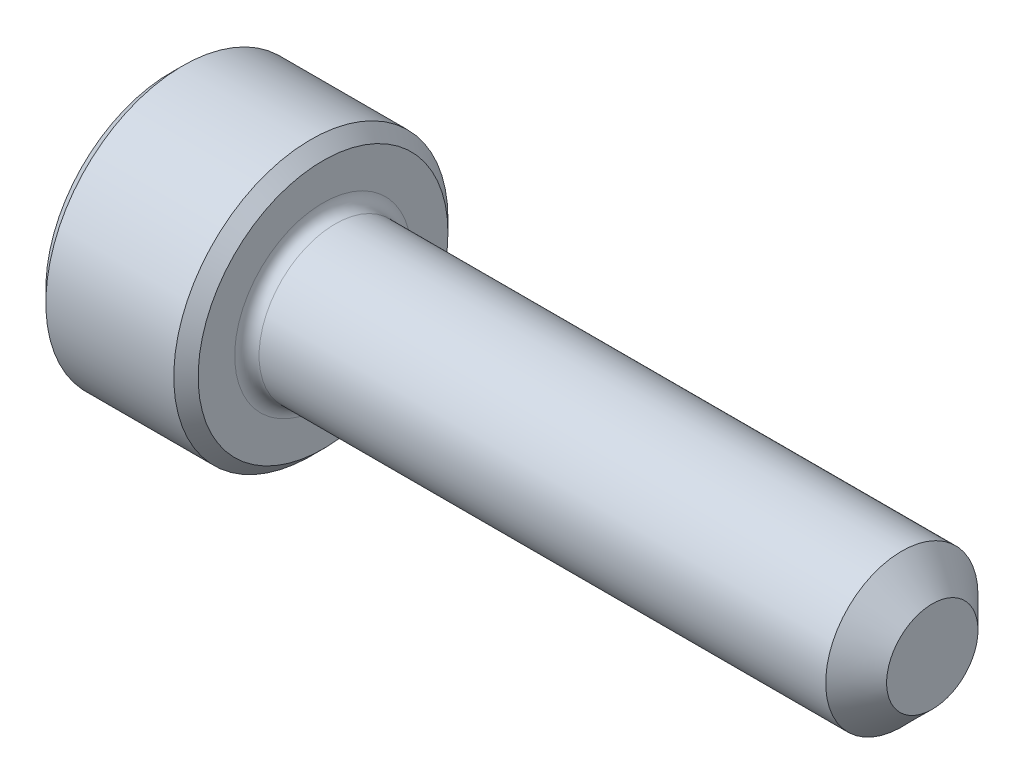
ISO-10303-21;
HEADER;
FILE_DESCRIPTION(('STEP AP214'),'2;1');
FILE_NAME('part.step','',(''),(''),'','','');
FILE_SCHEMA(('AUTOMOTIVE_DESIGN { 1 0 10303 214 1 1 1 1 }'));
ENDSEC;
DATA;
#1=APPLICATION_CONTEXT('core data for automotive mechanical design processes');
#2=APPLICATION_PROTOCOL_DEFINITION('international standard','automotive_design',2000,#1);
#3=PRODUCT_CONTEXT('',#1,'mechanical');
#4=PRODUCT('Part','Part','',(#3));
#5=PRODUCT_RELATED_PRODUCT_CATEGORY('part','',(#4));
#6=PRODUCT_DEFINITION_FORMATION('','',#4);
#7=PRODUCT_DEFINITION_CONTEXT('part definition',#1,'design');
#8=PRODUCT_DEFINITION('design','',#6,#7);
#9=PRODUCT_DEFINITION_SHAPE('','',#8);
#10=(LENGTH_UNIT() NAMED_UNIT(*) SI_UNIT(.MILLI.,.METRE.));
#11=(NAMED_UNIT(*) PLANE_ANGLE_UNIT() SI_UNIT($,.RADIAN.));
#12=(NAMED_UNIT(*) SI_UNIT($,.STERADIAN.) SOLID_ANGLE_UNIT());
#13=UNCERTAINTY_MEASURE_WITH_UNIT(LENGTH_MEASURE(1.E-05),#10,'distance_accuracy_value','');
#14=(GEOMETRIC_REPRESENTATION_CONTEXT(3) GLOBAL_UNCERTAINTY_ASSIGNED_CONTEXT((#13)) GLOBAL_UNIT_ASSIGNED_CONTEXT((#10,
#11,#12)) REPRESENTATION_CONTEXT('',''));
#15=CARTESIAN_POINT('',(0.,0.,0.));
#16=DIRECTION('',(0.,0.,1.));
#17=DIRECTION('',(1.,0.,0.));
#18=AXIS2_PLACEMENT_3D('',#15,#16,#17);
#19=CARTESIAN_POINT('',(12.5,0.75,0.));
#20=DIRECTION('',(1.,0.,0.));
#21=DIRECTION('',(0.,0.,-1.));
#22=AXIS2_PLACEMENT_3D('',#19,#20,#21);
#23=PLANE('',#22);
#24=CARTESIAN_POINT('',(12.5,0.,0.));
#25=DIRECTION('',(1.,0.,0.));
#26=DIRECTION('',(0.,0.,-1.));
#27=AXIS2_PLACEMENT_3D('',#24,#25,#26);
#28=CIRCLE('',#27,0.75);
#29=CARTESIAN_POINT('',(12.5,0.,-0.75));
#30=VERTEX_POINT('',#29);
#31=EDGE_CURVE('E11',#30,#30,#28,.T.);
#32=ORIENTED_EDGE('',*,*,#31,.T.);
#33=EDGE_LOOP('',(#32));
#34=FACE_BOUND('',#33,.T.);
#35=ADVANCED_FACE('F40',(#34),#23,.T.);
#36=CARTESIAN_POINT('',(12.5,0.,0.));
#37=DIRECTION('',(-1.,0.,0.));
#38=DIRECTION('',(0.,0.,1.));
#39=AXIS2_PLACEMENT_3D('',#36,#37,#38);
#40=CONICAL_SURFACE('',#39,0.75,0.785398163397448);
#41=CARTESIAN_POINT('',(12.,0.,0.));
#42=DIRECTION('',(1.,0.,0.));
#43=DIRECTION('',(0.,0.,-1.));
#44=AXIS2_PLACEMENT_3D('',#41,#42,#43);
#45=CIRCLE('',#44,1.25);
#46=CARTESIAN_POINT('',(12.,0.,-1.25));
#47=VERTEX_POINT('',#46);
#48=EDGE_CURVE('E48',#47,#47,#45,.T.);
#49=ORIENTED_EDGE('',*,*,#48,.T.);
#50=EDGE_LOOP('',(#49));
#51=FACE_BOUND('',#50,.T.);
#52=ORIENTED_EDGE('',*,*,#31,.F.);
#53=EDGE_LOOP('',(#52));
#54=FACE_BOUND('',#53,.T.);
#55=ADVANCED_FACE('F190',(#51,#54),#40,.T.);
#56=CARTESIAN_POINT('',(0.,0.,0.));
#57=DIRECTION('',(1.,0.,0.));
#58=DIRECTION('',(0.,0.,-1.));
#59=AXIS2_PLACEMENT_3D('',#56,#57,#58);
#60=CYLINDRICAL_SURFACE('',#59,1.25);
#61=CARTESIAN_POINT('',(2.7,0.,0.));
#62=DIRECTION('',(1.,0.,0.));
#63=DIRECTION('',(0.,0.,-1.));
#64=AXIS2_PLACEMENT_3D('',#61,#62,#63);
#65=CIRCLE('',#64,1.25);
#66=CARTESIAN_POINT('',(2.7,0.,-1.25));
#67=VERTEX_POINT('',#66);
#68=EDGE_CURVE('E183',#67,#67,#65,.T.);
#69=ORIENTED_EDGE('',*,*,#68,.T.);
#70=EDGE_LOOP('',(#69));
#71=FACE_BOUND('',#70,.T.);
#72=ORIENTED_EDGE('',*,*,#48,.F.);
#73=EDGE_LOOP('',(#72));
#74=FACE_BOUND('',#73,.T.);
#75=ADVANCED_FACE('F193',(#71,#74),#60,.T.);
#76=CARTESIAN_POINT('',(2.7,0.,0.));
#77=DIRECTION('',(1.,0.,0.));
#78=DIRECTION('',(0.,0.,-1.));
#79=AXIS2_PLACEMENT_3D('',#76,#77,#78);
#80=TOROIDAL_SURFACE('',#79,1.45,0.2);
#81=CARTESIAN_POINT('',(2.5,0.,0.));
#82=DIRECTION('',(1.,0.,0.));
#83=DIRECTION('',(0.,0.,-1.));
#84=AXIS2_PLACEMENT_3D('',#81,#82,#83);
#85=CIRCLE('',#84,1.45);
#86=CARTESIAN_POINT('',(2.5,0.,-1.45));
#87=VERTEX_POINT('',#86);
#88=EDGE_CURVE('E179',#87,#87,#85,.T.);
#89=ORIENTED_EDGE('',*,*,#88,.T.);
#90=EDGE_LOOP('',(#89));
#91=FACE_BOUND('',#90,.T.);
#92=ORIENTED_EDGE('',*,*,#68,.F.);
#93=EDGE_LOOP('',(#92));
#94=FACE_BOUND('',#93,.T.);
#95=ADVANCED_FACE('F195',(#91,#94),#80,.F.);
#96=CARTESIAN_POINT('',(2.5,2.05,0.));
#97=DIRECTION('',(1.,0.,0.));
#98=DIRECTION('',(0.,0.,-1.));
#99=AXIS2_PLACEMENT_3D('',#96,#97,#98);
#100=PLANE('',#99);
#101=CARTESIAN_POINT('',(2.5,0.,0.));
#102=DIRECTION('',(1.,0.,0.));
#103=DIRECTION('',(0.,0.,-1.));
#104=AXIS2_PLACEMENT_3D('',#101,#102,#103);
#105=CIRCLE('',#104,2.05);
#106=CARTESIAN_POINT('',(2.5,0.,-2.05));
#107=VERTEX_POINT('',#106);
#108=EDGE_CURVE('E175',#107,#107,#105,.T.);
#109=ORIENTED_EDGE('',*,*,#108,.T.);
#110=EDGE_LOOP('',(#109));
#111=FACE_BOUND('',#110,.T.);
#112=ORIENTED_EDGE('',*,*,#88,.F.);
#113=EDGE_LOOP('',(#112));
#114=FACE_BOUND('',#113,.T.);
#115=ADVANCED_FACE('F201',(#111,#114),#100,.T.);
#116=CARTESIAN_POINT('',(2.5,0.,0.));
#117=DIRECTION('',(-1.,0.,0.));
#118=DIRECTION('',(0.,0.,1.));
#119=AXIS2_PLACEMENT_3D('',#116,#117,#118);
#120=CONICAL_SURFACE('',#119,2.05,0.785398163397448);
#121=CARTESIAN_POINT('',(2.3,0.,0.));
#122=DIRECTION('',(1.,0.,0.));
#123=DIRECTION('',(0.,0.,-1.));
#124=AXIS2_PLACEMENT_3D('',#121,#122,#123);
#125=CIRCLE('',#124,2.25);
#126=CARTESIAN_POINT('',(2.3,0.,-2.25));
#127=VERTEX_POINT('',#126);
#128=EDGE_CURVE('E172',#127,#127,#125,.T.);
#129=ORIENTED_EDGE('',*,*,#128,.T.);
#130=EDGE_LOOP('',(#129));
#131=FACE_BOUND('',#130,.T.);
#132=ORIENTED_EDGE('',*,*,#108,.F.);
#133=EDGE_LOOP('',(#132));
#134=FACE_BOUND('',#133,.T.);
#135=ADVANCED_FACE('F229',(#131,#134),#120,.T.);
#136=CARTESIAN_POINT('',(0.,0.,0.));
#137=DIRECTION('',(1.,0.,0.));
#138=DIRECTION('',(0.,0.,-1.));
#139=AXIS2_PLACEMENT_3D('',#136,#137,#138);
#140=CYLINDRICAL_SURFACE('',#139,2.25);
#141=CARTESIAN_POINT('',(0.2,0.,0.));
#142=DIRECTION('',(1.,0.,0.));
#143=DIRECTION('',(0.,0.,-1.));
#144=AXIS2_PLACEMENT_3D('',#141,#142,#143);
#145=CIRCLE('',#144,2.25);
#146=CARTESIAN_POINT('',(0.2,0.,-2.25));
#147=VERTEX_POINT('',#146);
#148=EDGE_CURVE('E168',#147,#147,#145,.T.);
#149=ORIENTED_EDGE('',*,*,#148,.T.);
#150=EDGE_LOOP('',(#149));
#151=FACE_BOUND('',#150,.T.);
#152=ORIENTED_EDGE('',*,*,#128,.F.);
#153=EDGE_LOOP('',(#152));
#154=FACE_BOUND('',#153,.T.);
#155=ADVANCED_FACE('F238',(#151,#154),#140,.T.);
#156=CARTESIAN_POINT('',(0.2,0.,0.));
#157=DIRECTION('',(1.,0.,0.));
#158=DIRECTION('',(0.,0.,-1.));
#159=AXIS2_PLACEMENT_3D('',#156,#157,#158);
#160=CONICAL_SURFACE('',#159,2.25,0.785398163397449);
#161=CARTESIAN_POINT('',(0.,0.,0.));
#162=DIRECTION('',(1.,0.,0.));
#163=DIRECTION('',(0.,0.,-1.));
#164=AXIS2_PLACEMENT_3D('',#161,#162,#163);
#165=CIRCLE('',#164,2.05);
#166=CARTESIAN_POINT('',(0.,0.,-2.05));
#167=VERTEX_POINT('',#166);
#168=EDGE_CURVE('E155',#167,#167,#165,.T.);
#169=ORIENTED_EDGE('',*,*,#168,.T.);
#170=EDGE_LOOP('',(#169));
#171=FACE_BOUND('',#170,.T.);
#172=ORIENTED_EDGE('',*,*,#148,.F.);
#173=EDGE_LOOP('',(#172));
#174=FACE_BOUND('',#173,.T.);
#175=ADVANCED_FACE('F247',(#171,#174),#160,.T.);
#176=CARTESIAN_POINT('',(0.,0.,0.));
#177=DIRECTION('',(-1.,0.,0.));
#178=DIRECTION('',(0.,0.,1.));
#179=AXIS2_PLACEMENT_3D('',#176,#177,#178);
#180=PLANE('',#179);
#181=DIRECTION('',(0.,0.5,-0.866025403784438));
#182=VECTOR('',#181,1.);
#183=CARTESIAN_POINT('',(0.,0.577350269189626,1.));
#184=LINE('',#183,#182);
#185=CARTESIAN_POINT('',(0.,0.577350269189626,1.));
#186=VERTEX_POINT('',#185);
#187=CARTESIAN_POINT('',(0.,1.15470053837925,0.));
#188=VERTEX_POINT('',#187);
#189=EDGE_CURVE('E55',#186,#188,#184,.T.);
#190=ORIENTED_EDGE('',*,*,#189,.F.);
#191=DIRECTION('',(0.,1.,0.));
#192=VECTOR('',#191,1.);
#193=CARTESIAN_POINT('',(0.,-0.577350269189627,1.));
#194=LINE('',#193,#192);
#195=CARTESIAN_POINT('',(0.,-0.577350269189627,1.));
#196=VERTEX_POINT('',#195);
#197=EDGE_CURVE('E149',#196,#186,#194,.T.);
#198=ORIENTED_EDGE('',*,*,#197,.F.);
#199=DIRECTION('',(0.,0.5,0.866025403784439));
#200=VECTOR('',#199,1.);
#201=CARTESIAN_POINT('',(0.,-1.15470053837925,0.));
#202=LINE('',#201,#200);
#203=CARTESIAN_POINT('',(0.,-1.15470053837925,0.));
#204=VERTEX_POINT('',#203);
#205=EDGE_CURVE('E146',#204,#196,#202,.T.);
#206=ORIENTED_EDGE('',*,*,#205,.F.);
#207=DIRECTION('',(0.,-0.5,0.866025403784439));
#208=VECTOR('',#207,1.);
#209=CARTESIAN_POINT('',(0.,-0.577350269189626,-1.));
#210=LINE('',#209,#208);
#211=CARTESIAN_POINT('',(0.,-0.577350269189626,-1.));
#212=VERTEX_POINT('',#211);
#213=EDGE_CURVE('E103',#212,#204,#210,.T.);
#214=ORIENTED_EDGE('',*,*,#213,.F.);
#215=DIRECTION('',(0.,-1.,0.));
#216=VECTOR('',#215,1.);
#217=CARTESIAN_POINT('',(0.,0.577350269189626,-1.));
#218=LINE('',#217,#216);
#219=CARTESIAN_POINT('',(0.,0.577350269189626,-1.));
#220=VERTEX_POINT('',#219);
#221=EDGE_CURVE('E140',#220,#212,#218,.T.);
#222=ORIENTED_EDGE('',*,*,#221,.F.);
#223=DIRECTION('',(0.,-0.5,-0.866025403784439));
#224=VECTOR('',#223,1.);
#225=CARTESIAN_POINT('',(0.,1.15470053837925,0.));
#226=LINE('',#225,#224);
#227=EDGE_CURVE('E136',#188,#220,#226,.T.);
#228=ORIENTED_EDGE('',*,*,#227,.F.);
#229=EDGE_LOOP('',(#190,#198,#206,#214,#222,#228));
#230=FACE_BOUND('',#229,.T.);
#231=ORIENTED_EDGE('',*,*,#168,.F.);
#232=EDGE_LOOP('',(#231));
#233=FACE_BOUND('',#232,.T.);
#234=ADVANCED_FACE('F256',(#230,#233),#180,.T.);
#235=CARTESIAN_POINT('',(1.1,0.577350269189626,1.));
#236=DIRECTION('',(0.,0.866025403784439,0.5));
#237=DIRECTION('',(0.,-0.5,0.866025403784439));
#238=AXIS2_PLACEMENT_3D('',#235,#236,#237);
#239=PLANE('',#238);
#240=ORIENTED_EDGE('',*,*,#189,.T.);
#241=DIRECTION('',(-1.,0.,0.));
#242=VECTOR('',#241,1.);
#243=CARTESIAN_POINT('',(1.1,1.15470053837925,0.));
#244=LINE('',#243,#242);
#245=CARTESIAN_POINT('',(1.1,1.15470053837925,0.));
#246=VERTEX_POINT('',#245);
#247=EDGE_CURVE('E85',#246,#188,#244,.T.);
#248=ORIENTED_EDGE('',*,*,#247,.F.);
#249=DIRECTION('',(0.,0.5,-0.866025403784438));
#250=VECTOR('',#249,1.);
#251=CARTESIAN_POINT('',(1.1,0.577350269189626,1.));
#252=LINE('',#251,#250);
#253=CARTESIAN_POINT('',(1.1,0.577350269189626,1.));
#254=VERTEX_POINT('',#253);
#255=EDGE_CURVE('E152',#254,#246,#252,.T.);
#256=ORIENTED_EDGE('',*,*,#255,.F.);
#257=DIRECTION('',(-1.,0.,0.));
#258=VECTOR('',#257,1.);
#259=CARTESIAN_POINT('',(1.1,0.577350269189626,1.));
#260=LINE('',#259,#258);
#261=EDGE_CURVE('E63',#254,#186,#260,.T.);
#262=ORIENTED_EDGE('',*,*,#261,.T.);
#263=EDGE_LOOP('',(#240,#248,#256,#262));
#264=FACE_BOUND('',#263,.T.);
#265=ADVANCED_FACE('F265',(#264),#239,.F.);
#266=CARTESIAN_POINT('',(1.1,-0.577350269189627,1.));
#267=DIRECTION('',(0.,0.,1.));
#268=DIRECTION('',(1.,0.,0.));
#269=AXIS2_PLACEMENT_3D('',#266,#267,#268);
#270=PLANE('',#269);
#271=ORIENTED_EDGE('',*,*,#197,.T.);
#272=ORIENTED_EDGE('',*,*,#261,.F.);
#273=DIRECTION('',(0.,1.,0.));
#274=VECTOR('',#273,1.);
#275=CARTESIAN_POINT('',(1.1,-0.577350269189627,1.));
#276=LINE('',#275,#274);
#277=CARTESIAN_POINT('',(1.1,-0.577350269189627,1.));
#278=VERTEX_POINT('',#277);
#279=EDGE_CURVE('E117',#278,#254,#276,.T.);
#280=ORIENTED_EDGE('',*,*,#279,.F.);
#281=DIRECTION('',(-1.,0.,0.));
#282=VECTOR('',#281,1.);
#283=CARTESIAN_POINT('',(1.1,-0.577350269189627,1.));
#284=LINE('',#283,#282);
#285=EDGE_CURVE('E108',#278,#196,#284,.T.);
#286=ORIENTED_EDGE('',*,*,#285,.T.);
#287=EDGE_LOOP('',(#271,#272,#280,#286));
#288=FACE_BOUND('',#287,.T.);
#289=ADVANCED_FACE('F274',(#288),#270,.F.);
#290=CARTESIAN_POINT('',(1.1,-1.15470053837925,0.));
#291=DIRECTION('',(0.,-0.866025403784439,0.5));
#292=DIRECTION('',(0.,-0.5,-0.866025403784439));
#293=AXIS2_PLACEMENT_3D('',#290,#291,#292);
#294=PLANE('',#293);
#295=ORIENTED_EDGE('',*,*,#205,.T.);
#296=ORIENTED_EDGE('',*,*,#285,.F.);
#297=DIRECTION('',(0.,0.5,0.866025403784439));
#298=VECTOR('',#297,1.);
#299=CARTESIAN_POINT('',(1.1,-1.15470053837925,0.));
#300=LINE('',#299,#298);
#301=CARTESIAN_POINT('',(1.1,-1.15470053837925,0.));
#302=VERTEX_POINT('',#301);
#303=EDGE_CURVE('E112',#302,#278,#300,.T.);
#304=ORIENTED_EDGE('',*,*,#303,.F.);
#305=DIRECTION('',(-1.,0.,0.));
#306=VECTOR('',#305,1.);
#307=CARTESIAN_POINT('',(1.1,-1.15470053837925,0.));
#308=LINE('',#307,#306);
#309=EDGE_CURVE('E96',#302,#204,#308,.T.);
#310=ORIENTED_EDGE('',*,*,#309,.T.);
#311=EDGE_LOOP('',(#295,#296,#304,#310));
#312=FACE_BOUND('',#311,.T.);
#313=ADVANCED_FACE('F113',(#312),#294,.F.);
#314=CARTESIAN_POINT('',(1.1,-0.577350269189626,-1.));
#315=DIRECTION('',(0.,-0.866025403784439,-0.5));
#316=DIRECTION('',(0.,0.5,-0.866025403784439));
#317=AXIS2_PLACEMENT_3D('',#314,#315,#316);
#318=PLANE('',#317);
#319=ORIENTED_EDGE('',*,*,#213,.T.);
#320=ORIENTED_EDGE('',*,*,#309,.F.);
#321=DIRECTION('',(0.,-0.5,0.866025403784439));
#322=VECTOR('',#321,1.);
#323=CARTESIAN_POINT('',(1.1,-0.577350269189626,-1.));
#324=LINE('',#323,#322);
#325=CARTESIAN_POINT('',(1.1,-0.577350269189626,-1.));
#326=VERTEX_POINT('',#325);
#327=EDGE_CURVE('E100',#326,#302,#324,.T.);
#328=ORIENTED_EDGE('',*,*,#327,.F.);
#329=DIRECTION('',(-1.,0.,0.));
#330=VECTOR('',#329,1.);
#331=CARTESIAN_POINT('',(1.1,-0.577350269189626,-1.));
#332=LINE('',#331,#330);
#333=EDGE_CURVE('E109',#326,#212,#332,.T.);
#334=ORIENTED_EDGE('',*,*,#333,.T.);
#335=EDGE_LOOP('',(#319,#320,#328,#334));
#336=FACE_BOUND('',#335,.T.);
#337=ADVANCED_FACE('F98',(#336),#318,.F.);
#338=CARTESIAN_POINT('',(1.1,0.577350269189626,-1.));
#339=DIRECTION('',(0.,0.,-1.));
#340=DIRECTION('',(-1.,0.,0.));
#341=AXIS2_PLACEMENT_3D('',#338,#339,#340);
#342=PLANE('',#341);
#343=ORIENTED_EDGE('',*,*,#221,.T.);
#344=ORIENTED_EDGE('',*,*,#333,.F.);
#345=DIRECTION('',(0.,-1.,0.));
#346=VECTOR('',#345,1.);
#347=CARTESIAN_POINT('',(1.1,0.577350269189626,-1.));
#348=LINE('',#347,#346);
#349=CARTESIAN_POINT('',(1.1,0.577350269189626,-1.));
#350=VERTEX_POINT('',#349);
#351=EDGE_CURVE('E123',#350,#326,#348,.T.);
#352=ORIENTED_EDGE('',*,*,#351,.F.);
#353=DIRECTION('',(-1.,0.,0.));
#354=VECTOR('',#353,1.);
#355=CARTESIAN_POINT('',(1.1,0.577350269189626,-1.));
#356=LINE('',#355,#354);
#357=EDGE_CURVE('E160',#350,#220,#356,.T.);
#358=ORIENTED_EDGE('',*,*,#357,.T.);
#359=EDGE_LOOP('',(#343,#344,#352,#358));
#360=FACE_BOUND('',#359,.T.);
#361=ADVANCED_FACE('F296',(#360),#342,.F.);
#362=CARTESIAN_POINT('',(1.1,1.15470053837925,0.));
#363=DIRECTION('',(0.,0.866025403784439,-0.5));
#364=DIRECTION('',(0.,0.5,0.866025403784439));
#365=AXIS2_PLACEMENT_3D('',#362,#363,#364);
#366=PLANE('',#365);
#367=ORIENTED_EDGE('',*,*,#227,.T.);
#368=ORIENTED_EDGE('',*,*,#357,.F.);
#369=DIRECTION('',(0.,-0.5,-0.866025403784439));
#370=VECTOR('',#369,1.);
#371=CARTESIAN_POINT('',(1.1,1.15470053837925,0.));
#372=LINE('',#371,#370);
#373=EDGE_CURVE('E128',#246,#350,#372,.T.);
#374=ORIENTED_EDGE('',*,*,#373,.F.);
#375=ORIENTED_EDGE('',*,*,#247,.T.);
#376=EDGE_LOOP('',(#367,#368,#374,#375));
#377=FACE_BOUND('',#376,.T.);
#378=ADVANCED_FACE('F304',(#377),#366,.F.);
#379=CARTESIAN_POINT('',(1.1,0.,0.));
#380=DIRECTION('',(-1.,0.,0.));
#381=DIRECTION('',(0.,0.,1.));
#382=AXIS2_PLACEMENT_3D('',#379,#380,#381);
#383=PLANE('',#382);
#384=ORIENTED_EDGE('',*,*,#255,.T.);
#385=ORIENTED_EDGE('',*,*,#373,.T.);
#386=ORIENTED_EDGE('',*,*,#351,.T.);
#387=ORIENTED_EDGE('',*,*,#327,.T.);
#388=ORIENTED_EDGE('',*,*,#303,.T.);
#389=ORIENTED_EDGE('',*,*,#279,.T.);
#390=EDGE_LOOP('',(#384,#385,#386,#387,#388,#389));
#391=FACE_BOUND('',#390,.T.);
#392=ADVANCED_FACE('F120',(#391),#383,.T.);
#393=CLOSED_SHELL('',(#35,#55,#75,#95,#115,#135,#155,#175,#234,#265,#289,#313,#337,#361,#378,#392));
#394=MANIFOLD_SOLID_BREP('B2',#393);
#395=ADVANCED_BREP_SHAPE_REPRESENTATION('',(#18,#394),#14);
#396=SHAPE_DEFINITION_REPRESENTATION(#9,#395);
ENDSEC;
END-ISO-10303-21;
